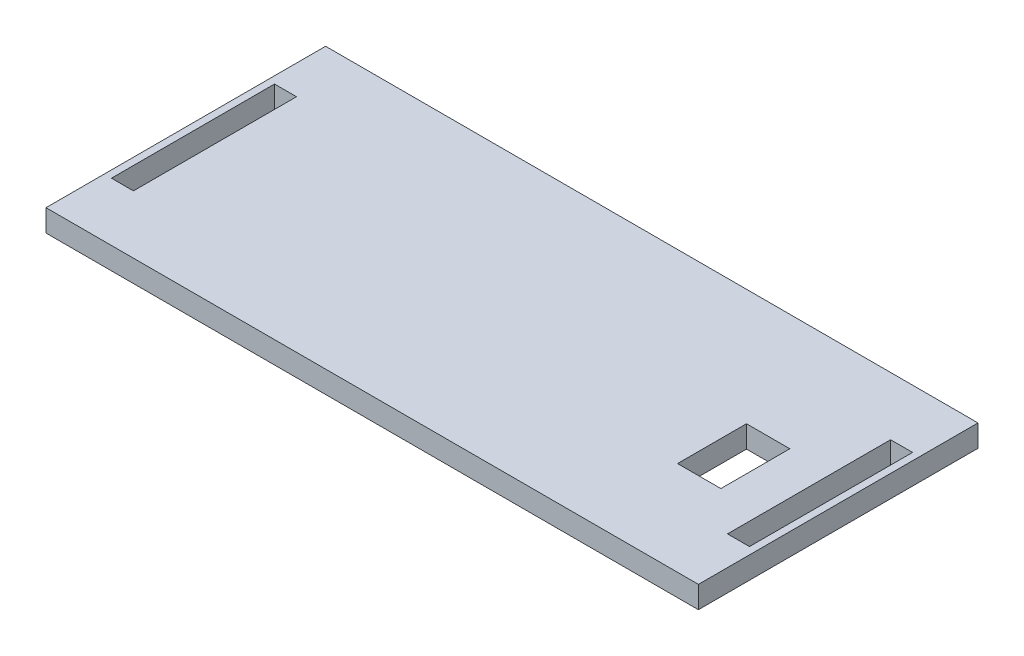
ISO-10303-21;
HEADER;
FILE_DESCRIPTION(('STEP AP214'),'2;1');
FILE_NAME('part.step','',(''),(''),'','','');
FILE_SCHEMA(('AUTOMOTIVE_DESIGN { 1 0 10303 214 1 1 1 1 }'));
ENDSEC;
DATA;
#1=APPLICATION_CONTEXT('core data for automotive mechanical design processes');
#2=APPLICATION_PROTOCOL_DEFINITION('international standard','automotive_design',2000,#1);
#3=PRODUCT_CONTEXT('',#1,'mechanical');
#4=PRODUCT('Part','Part','',(#3));
#5=PRODUCT_RELATED_PRODUCT_CATEGORY('part','',(#4));
#6=PRODUCT_DEFINITION_FORMATION('','',#4);
#7=PRODUCT_DEFINITION_CONTEXT('part definition',#1,'design');
#8=PRODUCT_DEFINITION('design','',#6,#7);
#9=PRODUCT_DEFINITION_SHAPE('','',#8);
#10=(LENGTH_UNIT() NAMED_UNIT(*) SI_UNIT(.MILLI.,.METRE.));
#11=(NAMED_UNIT(*) PLANE_ANGLE_UNIT() SI_UNIT($,.RADIAN.));
#12=(NAMED_UNIT(*) SI_UNIT($,.STERADIAN.) SOLID_ANGLE_UNIT());
#13=UNCERTAINTY_MEASURE_WITH_UNIT(LENGTH_MEASURE(1.E-05),#10,'distance_accuracy_value','');
#14=(GEOMETRIC_REPRESENTATION_CONTEXT(3) GLOBAL_UNCERTAINTY_ASSIGNED_CONTEXT((#13)) GLOBAL_UNIT_ASSIGNED_CONTEXT((#10,
#11,#12)) REPRESENTATION_CONTEXT('',''));
#15=CARTESIAN_POINT('',(0.,0.,0.));
#16=DIRECTION('',(0.,0.,1.));
#17=DIRECTION('',(1.,0.,0.));
#18=AXIS2_PLACEMENT_3D('',#15,#16,#17);
#19=CARTESIAN_POINT('',(0.,5.9944,0.));
#20=DIRECTION('',(0.,1.,0.));
#21=DIRECTION('',(0.,0.,1.));
#22=AXIS2_PLACEMENT_3D('',#19,#20,#21);
#23=PLANE('',#22);
#24=DIRECTION('',(0.,0.,1.));
#25=VECTOR('',#24,1.);
#26=CARTESIAN_POINT('',(0.,5.9944,0.));
#27=LINE('',#26,#25);
#28=CARTESIAN_POINT('',(0.,5.9944,0.));
#29=VERTEX_POINT('',#28);
#30=CARTESIAN_POINT('',(0.,5.9944,76.2));
#31=VERTEX_POINT('',#30);
#32=EDGE_CURVE('E251',#29,#31,#27,.T.);
#33=ORIENTED_EDGE('',*,*,#32,.T.);
#34=DIRECTION('',(1.,0.,0.));
#35=VECTOR('',#34,1.);
#36=CARTESIAN_POINT('',(0.,5.9944,76.2));
#37=LINE('',#36,#35);
#38=CARTESIAN_POINT('',(177.8,5.9944,76.2));
#39=VERTEX_POINT('',#38);
#40=EDGE_CURVE('E254',#31,#39,#37,.T.);
#41=ORIENTED_EDGE('',*,*,#40,.T.);
#42=DIRECTION('',(0.,0.,-1.));
#43=VECTOR('',#42,1.);
#44=CARTESIAN_POINT('',(177.8,5.9944,0.));
#45=LINE('',#44,#43);
#46=CARTESIAN_POINT('',(177.8,5.9944,0.));
#47=VERTEX_POINT('',#46);
#48=EDGE_CURVE('E257',#39,#47,#45,.T.);
#49=ORIENTED_EDGE('',*,*,#48,.T.);
#50=DIRECTION('',(-1.,0.,0.));
#51=VECTOR('',#50,1.);
#52=CARTESIAN_POINT('',(0.,5.9944,0.));
#53=LINE('',#52,#51);
#54=EDGE_CURVE('E259',#47,#29,#53,.T.);
#55=ORIENTED_EDGE('',*,*,#54,.T.);
#56=EDGE_LOOP('',(#33,#41,#49,#55));
#57=FACE_BOUND('',#56,.T.);
#58=DIRECTION('',(1.,0.,0.));
#59=VECTOR('',#58,1.);
#60=CARTESIAN_POINT('',(1.95480000200001,5.9944,60.325));
#61=LINE('',#60,#59);
#62=CARTESIAN_POINT('',(1.95480000200001,5.9944,60.325));
#63=VERTEX_POINT('',#62);
#64=CARTESIAN_POINT('',(7.94920000200001,5.9944,60.325));
#65=VERTEX_POINT('',#64);
#66=EDGE_CURVE('E222',#63,#65,#61,.T.);
#67=ORIENTED_EDGE('',*,*,#66,.F.);
#68=DIRECTION('',(0.,0.,1.));
#69=VECTOR('',#68,1.);
#70=CARTESIAN_POINT('',(1.95480000200001,5.9944,15.875));
#71=LINE('',#70,#69);
#72=CARTESIAN_POINT('',(1.95480000200001,5.9944,15.875));
#73=VERTEX_POINT('',#72);
#74=EDGE_CURVE('E220',#73,#63,#71,.T.);
#75=ORIENTED_EDGE('',*,*,#74,.F.);
#76=DIRECTION('',(-1.,0.,0.));
#77=VECTOR('',#76,1.);
#78=CARTESIAN_POINT('',(1.95480000200001,5.9944,15.875));
#79=LINE('',#78,#77);
#80=CARTESIAN_POINT('',(7.94920000200001,5.9944,15.875));
#81=VERTEX_POINT('',#80);
#82=EDGE_CURVE('E228',#81,#73,#79,.T.);
#83=ORIENTED_EDGE('',*,*,#82,.F.);
#84=DIRECTION('',(0.,0.,-1.));
#85=VECTOR('',#84,1.);
#86=CARTESIAN_POINT('',(7.94920000200001,5.9944,15.875));
#87=LINE('',#86,#85);
#88=EDGE_CURVE('E225',#65,#81,#87,.T.);
#89=ORIENTED_EDGE('',*,*,#88,.F.);
#90=EDGE_LOOP('',(#67,#75,#83,#89));
#91=FACE_BOUND('',#90,.T.);
#92=DIRECTION('',(-1.,0.,0.));
#93=VECTOR('',#92,1.);
#94=CARTESIAN_POINT('',(175.845199998,5.9944,15.875));
#95=LINE('',#94,#93);
#96=CARTESIAN_POINT('',(175.845199998,5.9944,15.875));
#97=VERTEX_POINT('',#96);
#98=CARTESIAN_POINT('',(169.850799998,5.9944,15.875));
#99=VERTEX_POINT('',#98);
#100=EDGE_CURVE('E191',#97,#99,#95,.T.);
#101=ORIENTED_EDGE('',*,*,#100,.F.);
#102=DIRECTION('',(0.,0.,-1.));
#103=VECTOR('',#102,1.);
#104=CARTESIAN_POINT('',(175.845199998,5.9944,15.875));
#105=LINE('',#104,#103);
#106=CARTESIAN_POINT('',(175.845199998,5.9944,60.325));
#107=VERTEX_POINT('',#106);
#108=EDGE_CURVE('E189',#107,#97,#105,.T.);
#109=ORIENTED_EDGE('',*,*,#108,.F.);
#110=DIRECTION('',(1.,0.,0.));
#111=VECTOR('',#110,1.);
#112=CARTESIAN_POINT('',(175.845199998,5.9944,60.325));
#113=LINE('',#112,#111);
#114=CARTESIAN_POINT('',(169.850799998,5.9944,60.325));
#115=VERTEX_POINT('',#114);
#116=EDGE_CURVE('E197',#115,#107,#113,.T.);
#117=ORIENTED_EDGE('',*,*,#116,.F.);
#118=DIRECTION('',(0.,0.,1.));
#119=VECTOR('',#118,1.);
#120=CARTESIAN_POINT('',(169.850799998,5.9944,15.875));
#121=LINE('',#120,#119);
#122=EDGE_CURVE('E194',#99,#115,#121,.T.);
#123=ORIENTED_EDGE('',*,*,#122,.F.);
#124=EDGE_LOOP('',(#101,#109,#117,#123));
#125=FACE_BOUND('',#124,.T.);
#126=DIRECTION('',(-1.,0.,0.));
#127=VECTOR('',#126,1.);
#128=CARTESIAN_POINT('',(158.255699998,5.9944,31.7373));
#129=LINE('',#128,#127);
#130=CARTESIAN_POINT('',(158.255699998,5.9944,31.7373));
#131=VERTEX_POINT('',#130);
#132=CARTESIAN_POINT('',(146.444699998,5.9944,31.7373));
#133=VERTEX_POINT('',#132);
#134=EDGE_CURVE('E161',#131,#133,#129,.T.);
#135=ORIENTED_EDGE('',*,*,#134,.F.);
#136=DIRECTION('',(0.,0.,-1.));
#137=VECTOR('',#136,1.);
#138=CARTESIAN_POINT('',(158.255699998,5.9944,31.7373));
#139=LINE('',#138,#137);
#140=CARTESIAN_POINT('',(158.255699998,5.9944,50.5333));
#141=VERTEX_POINT('',#140);
#142=EDGE_CURVE('E153',#141,#131,#139,.T.);
#143=ORIENTED_EDGE('',*,*,#142,.F.);
#144=DIRECTION('',(1.,0.,0.));
#145=VECTOR('',#144,1.);
#146=CARTESIAN_POINT('',(158.255699998,5.9944,50.5333));
#147=LINE('',#146,#145);
#148=CARTESIAN_POINT('',(146.444699998,5.9944,50.5333));
#149=VERTEX_POINT('',#148);
#150=EDGE_CURVE('E175',#149,#141,#147,.T.);
#151=ORIENTED_EDGE('',*,*,#150,.F.);
#152=DIRECTION('',(0.,0.,1.));
#153=VECTOR('',#152,1.);
#154=CARTESIAN_POINT('',(146.444699998,5.9944,31.7373));
#155=LINE('',#154,#153);
#156=EDGE_CURVE('E173',#133,#149,#155,.T.);
#157=ORIENTED_EDGE('',*,*,#156,.F.);
#158=EDGE_LOOP('',(#135,#143,#151,#157));
#159=FACE_BOUND('',#158,.T.);
#160=ADVANCED_FACE('F40',(#57,#91,#125,#159),#23,.T.);
#161=CARTESIAN_POINT('',(0.,0.,0.));
#162=DIRECTION('',(0.,1.,0.));
#163=DIRECTION('',(0.,0.,1.));
#164=AXIS2_PLACEMENT_3D('',#161,#162,#163);
#165=PLANE('',#164);
#166=DIRECTION('',(0.,0.,-1.));
#167=VECTOR('',#166,1.);
#168=CARTESIAN_POINT('',(175.845199998,0.,15.875));
#169=LINE('',#168,#167);
#170=CARTESIAN_POINT('',(175.845199998,0.,60.325));
#171=VERTEX_POINT('',#170);
#172=CARTESIAN_POINT('',(175.845199998,0.,15.875));
#173=VERTEX_POINT('',#172);
#174=EDGE_CURVE('E169',#171,#173,#169,.T.);
#175=ORIENTED_EDGE('',*,*,#174,.T.);
#176=DIRECTION('',(-1.,0.,0.));
#177=VECTOR('',#176,1.);
#178=CARTESIAN_POINT('',(175.845199998,0.,15.875));
#179=LINE('',#178,#177);
#180=CARTESIAN_POINT('',(169.850799998,0.,15.875));
#181=VERTEX_POINT('',#180);
#182=EDGE_CURVE('E202',#173,#181,#179,.T.);
#183=ORIENTED_EDGE('',*,*,#182,.T.);
#184=DIRECTION('',(0.,0.,1.));
#185=VECTOR('',#184,1.);
#186=CARTESIAN_POINT('',(169.850799998,0.,15.875));
#187=LINE('',#186,#185);
#188=CARTESIAN_POINT('',(169.850799998,0.,60.325));
#189=VERTEX_POINT('',#188);
#190=EDGE_CURVE('E205',#181,#189,#187,.T.);
#191=ORIENTED_EDGE('',*,*,#190,.T.);
#192=DIRECTION('',(1.,0.,0.));
#193=VECTOR('',#192,1.);
#194=CARTESIAN_POINT('',(175.845199998,0.,60.325));
#195=LINE('',#194,#193);
#196=EDGE_CURVE('E192',#189,#171,#195,.T.);
#197=ORIENTED_EDGE('',*,*,#196,.T.);
#198=EDGE_LOOP('',(#175,#183,#191,#197));
#199=FACE_BOUND('',#198,.T.);
#200=DIRECTION('',(0.,0.,1.));
#201=VECTOR('',#200,1.);
#202=CARTESIAN_POINT('',(0.,0.,0.));
#203=LINE('',#202,#201);
#204=CARTESIAN_POINT('',(0.,0.,0.));
#205=VERTEX_POINT('',#204);
#206=CARTESIAN_POINT('',(0.,0.,76.2));
#207=VERTEX_POINT('',#206);
#208=EDGE_CURVE('E250',#205,#207,#203,.T.);
#209=ORIENTED_EDGE('',*,*,#208,.F.);
#210=DIRECTION('',(-1.,0.,0.));
#211=VECTOR('',#210,1.);
#212=CARTESIAN_POINT('',(0.,0.,0.));
#213=LINE('',#212,#211);
#214=CARTESIAN_POINT('',(177.8,0.,0.));
#215=VERTEX_POINT('',#214);
#216=EDGE_CURVE('E255',#215,#205,#213,.T.);
#217=ORIENTED_EDGE('',*,*,#216,.F.);
#218=DIRECTION('',(0.,0.,-1.));
#219=VECTOR('',#218,1.);
#220=CARTESIAN_POINT('',(177.8,0.,0.));
#221=LINE('',#220,#219);
#222=CARTESIAN_POINT('',(177.8,0.,76.2));
#223=VERTEX_POINT('',#222);
#224=EDGE_CURVE('E266',#223,#215,#221,.T.);
#225=ORIENTED_EDGE('',*,*,#224,.F.);
#226=DIRECTION('',(1.,0.,0.));
#227=VECTOR('',#226,1.);
#228=CARTESIAN_POINT('',(0.,0.,76.2));
#229=LINE('',#228,#227);
#230=EDGE_CURVE('E264',#207,#223,#229,.T.);
#231=ORIENTED_EDGE('',*,*,#230,.F.);
#232=EDGE_LOOP('',(#209,#217,#225,#231));
#233=FACE_BOUND('',#232,.T.);
#234=DIRECTION('',(0.,0.,1.));
#235=VECTOR('',#234,1.);
#236=CARTESIAN_POINT('',(1.95480000200001,0.,15.875));
#237=LINE('',#236,#235);
#238=CARTESIAN_POINT('',(1.95480000200001,0.,15.875));
#239=VERTEX_POINT('',#238);
#240=CARTESIAN_POINT('',(1.95480000200001,0.,60.325));
#241=VERTEX_POINT('',#240);
#242=EDGE_CURVE('E219',#239,#241,#237,.T.);
#243=ORIENTED_EDGE('',*,*,#242,.T.);
#244=DIRECTION('',(1.,0.,0.));
#245=VECTOR('',#244,1.);
#246=CARTESIAN_POINT('',(1.95480000200001,0.,60.325));
#247=LINE('',#246,#245);
#248=CARTESIAN_POINT('',(7.94920000200001,0.,60.325));
#249=VERTEX_POINT('',#248);
#250=EDGE_CURVE('E233',#241,#249,#247,.T.);
#251=ORIENTED_EDGE('',*,*,#250,.T.);
#252=DIRECTION('',(0.,0.,-1.));
#253=VECTOR('',#252,1.);
#254=CARTESIAN_POINT('',(7.94920000200001,0.,15.875));
#255=LINE('',#254,#253);
#256=CARTESIAN_POINT('',(7.94920000200001,0.,15.875));
#257=VERTEX_POINT('',#256);
#258=EDGE_CURVE('E236',#249,#257,#255,.T.);
#259=ORIENTED_EDGE('',*,*,#258,.T.);
#260=DIRECTION('',(-1.,0.,0.));
#261=VECTOR('',#260,1.);
#262=CARTESIAN_POINT('',(1.95480000200001,0.,15.875));
#263=LINE('',#262,#261);
#264=EDGE_CURVE('E223',#257,#239,#263,.T.);
#265=ORIENTED_EDGE('',*,*,#264,.T.);
#266=EDGE_LOOP('',(#243,#251,#259,#265));
#267=FACE_BOUND('',#266,.T.);
#268=DIRECTION('',(0.,0.,-1.));
#269=VECTOR('',#268,1.);
#270=CARTESIAN_POINT('',(158.255699998,0.,31.7373));
#271=LINE('',#270,#269);
#272=CARTESIAN_POINT('',(158.255699998,0.,50.5333));
#273=VERTEX_POINT('',#272);
#274=CARTESIAN_POINT('',(158.255699998,0.,31.7373));
#275=VERTEX_POINT('',#274);
#276=EDGE_CURVE('E63',#273,#275,#271,.T.);
#277=ORIENTED_EDGE('',*,*,#276,.T.);
#278=DIRECTION('',(-1.,0.,0.));
#279=VECTOR('',#278,1.);
#280=CARTESIAN_POINT('',(158.255699998,0.,31.7373));
#281=LINE('',#280,#279);
#282=CARTESIAN_POINT('',(146.444699998,0.,31.7373));
#283=VERTEX_POINT('',#282);
#284=EDGE_CURVE('E168',#275,#283,#281,.T.);
#285=ORIENTED_EDGE('',*,*,#284,.T.);
#286=DIRECTION('',(0.,0.,1.));
#287=VECTOR('',#286,1.);
#288=CARTESIAN_POINT('',(146.444699998,0.,31.7373));
#289=LINE('',#288,#287);
#290=CARTESIAN_POINT('',(146.444699998,0.,50.5333));
#291=VERTEX_POINT('',#290);
#292=EDGE_CURVE('E181',#283,#291,#289,.T.);
#293=ORIENTED_EDGE('',*,*,#292,.T.);
#294=DIRECTION('',(1.,0.,0.));
#295=VECTOR('',#294,1.);
#296=CARTESIAN_POINT('',(158.255699998,0.,50.5333));
#297=LINE('',#296,#295);
#298=EDGE_CURVE('E162',#291,#273,#297,.T.);
#299=ORIENTED_EDGE('',*,*,#298,.T.);
#300=EDGE_LOOP('',(#277,#285,#293,#299));
#301=FACE_BOUND('',#300,.T.);
#302=ADVANCED_FACE('F284',(#199,#233,#267,#301),#165,.F.);
#303=CARTESIAN_POINT('',(0.,5.9944,0.));
#304=DIRECTION('',(1.,0.,0.));
#305=DIRECTION('',(0.,0.,-1.));
#306=AXIS2_PLACEMENT_3D('',#303,#304,#305);
#307=PLANE('',#306);
#308=ORIENTED_EDGE('',*,*,#208,.T.);
#309=DIRECTION('',(0.,-1.,0.));
#310=VECTOR('',#309,1.);
#311=CARTESIAN_POINT('',(0.,5.9944,76.2));
#312=LINE('',#311,#310);
#313=EDGE_CURVE('E11',#31,#207,#312,.T.);
#314=ORIENTED_EDGE('',*,*,#313,.F.);
#315=ORIENTED_EDGE('',*,*,#32,.F.);
#316=DIRECTION('',(0.,-1.,0.));
#317=VECTOR('',#316,1.);
#318=CARTESIAN_POINT('',(0.,5.9944,0.));
#319=LINE('',#318,#317);
#320=EDGE_CURVE('E261',#29,#205,#319,.T.);
#321=ORIENTED_EDGE('',*,*,#320,.T.);
#322=EDGE_LOOP('',(#308,#314,#315,#321));
#323=FACE_BOUND('',#322,.T.);
#324=ADVANCED_FACE('F42',(#323),#307,.F.);
#325=CARTESIAN_POINT('',(0.,5.9944,76.2));
#326=DIRECTION('',(0.,0.,-1.));
#327=DIRECTION('',(-1.,0.,0.));
#328=AXIS2_PLACEMENT_3D('',#325,#326,#327);
#329=PLANE('',#328);
#330=ORIENTED_EDGE('',*,*,#230,.T.);
#331=DIRECTION('',(0.,-1.,0.));
#332=VECTOR('',#331,1.);
#333=CARTESIAN_POINT('',(177.8,5.9944,76.2));
#334=LINE('',#333,#332);
#335=EDGE_CURVE('E48',#39,#223,#334,.T.);
#336=ORIENTED_EDGE('',*,*,#335,.F.);
#337=ORIENTED_EDGE('',*,*,#40,.F.);
#338=ORIENTED_EDGE('',*,*,#313,.T.);
#339=EDGE_LOOP('',(#330,#336,#337,#338));
#340=FACE_BOUND('',#339,.T.);
#341=ADVANCED_FACE('F295',(#340),#329,.F.);
#342=CARTESIAN_POINT('',(177.8,5.9944,0.));
#343=DIRECTION('',(-1.,0.,0.));
#344=DIRECTION('',(0.,0.,1.));
#345=AXIS2_PLACEMENT_3D('',#342,#343,#344);
#346=PLANE('',#345);
#347=ORIENTED_EDGE('',*,*,#224,.T.);
#348=DIRECTION('',(0.,-1.,0.));
#349=VECTOR('',#348,1.);
#350=CARTESIAN_POINT('',(177.8,5.9944,0.));
#351=LINE('',#350,#349);
#352=EDGE_CURVE('E271',#47,#215,#351,.T.);
#353=ORIENTED_EDGE('',*,*,#352,.F.);
#354=ORIENTED_EDGE('',*,*,#48,.F.);
#355=ORIENTED_EDGE('',*,*,#335,.T.);
#356=EDGE_LOOP('',(#347,#353,#354,#355));
#357=FACE_BOUND('',#356,.T.);
#358=ADVANCED_FACE('F278',(#357),#346,.F.);
#359=CARTESIAN_POINT('',(0.,5.9944,0.));
#360=DIRECTION('',(0.,0.,1.));
#361=DIRECTION('',(1.,0.,0.));
#362=AXIS2_PLACEMENT_3D('',#359,#360,#361);
#363=PLANE('',#362);
#364=ORIENTED_EDGE('',*,*,#216,.T.);
#365=ORIENTED_EDGE('',*,*,#320,.F.);
#366=ORIENTED_EDGE('',*,*,#54,.F.);
#367=ORIENTED_EDGE('',*,*,#352,.T.);
#368=EDGE_LOOP('',(#364,#365,#366,#367));
#369=FACE_BOUND('',#368,.T.);
#370=ADVANCED_FACE('F288',(#369),#363,.F.);
#371=CARTESIAN_POINT('',(1.95480000200001,5.9944,15.875));
#372=DIRECTION('',(1.,0.,0.));
#373=DIRECTION('',(0.,0.,-1.));
#374=AXIS2_PLACEMENT_3D('',#371,#372,#373);
#375=PLANE('',#374);
#376=ORIENTED_EDGE('',*,*,#242,.F.);
#377=DIRECTION('',(0.,-1.,0.));
#378=VECTOR('',#377,1.);
#379=CARTESIAN_POINT('',(1.95480000200001,5.9944,15.875));
#380=LINE('',#379,#378);
#381=EDGE_CURVE('E230',#73,#239,#380,.T.);
#382=ORIENTED_EDGE('',*,*,#381,.F.);
#383=ORIENTED_EDGE('',*,*,#74,.T.);
#384=DIRECTION('',(0.,-1.,0.));
#385=VECTOR('',#384,1.);
#386=CARTESIAN_POINT('',(1.95480000200001,5.9944,60.325));
#387=LINE('',#386,#385);
#388=EDGE_CURVE('E247',#63,#241,#387,.T.);
#389=ORIENTED_EDGE('',*,*,#388,.T.);
#390=EDGE_LOOP('',(#376,#382,#383,#389));
#391=FACE_BOUND('',#390,.T.);
#392=ADVANCED_FACE('F310',(#391),#375,.T.);
#393=CARTESIAN_POINT('',(1.95480000200001,5.9944,60.325));
#394=DIRECTION('',(0.,0.,-1.));
#395=DIRECTION('',(-1.,0.,0.));
#396=AXIS2_PLACEMENT_3D('',#393,#394,#395);
#397=PLANE('',#396);
#398=ORIENTED_EDGE('',*,*,#250,.F.);
#399=ORIENTED_EDGE('',*,*,#388,.F.);
#400=ORIENTED_EDGE('',*,*,#66,.T.);
#401=DIRECTION('',(0.,-1.,0.));
#402=VECTOR('',#401,1.);
#403=CARTESIAN_POINT('',(7.94920000200001,5.9944,60.325));
#404=LINE('',#403,#402);
#405=EDGE_CURVE('E245',#65,#249,#404,.T.);
#406=ORIENTED_EDGE('',*,*,#405,.T.);
#407=EDGE_LOOP('',(#398,#399,#400,#406));
#408=FACE_BOUND('',#407,.T.);
#409=ADVANCED_FACE('F317',(#408),#397,.T.);
#410=CARTESIAN_POINT('',(7.94920000200001,5.9944,15.875));
#411=DIRECTION('',(-1.,0.,0.));
#412=DIRECTION('',(0.,0.,1.));
#413=AXIS2_PLACEMENT_3D('',#410,#411,#412);
#414=PLANE('',#413);
#415=ORIENTED_EDGE('',*,*,#258,.F.);
#416=ORIENTED_EDGE('',*,*,#405,.F.);
#417=ORIENTED_EDGE('',*,*,#88,.T.);
#418=DIRECTION('',(0.,-1.,0.));
#419=VECTOR('',#418,1.);
#420=CARTESIAN_POINT('',(7.94920000200001,5.9944,15.875));
#421=LINE('',#420,#419);
#422=EDGE_CURVE('E243',#81,#257,#421,.T.);
#423=ORIENTED_EDGE('',*,*,#422,.T.);
#424=EDGE_LOOP('',(#415,#416,#417,#423));
#425=FACE_BOUND('',#424,.T.);
#426=ADVANCED_FACE('F322',(#425),#414,.T.);
#427=CARTESIAN_POINT('',(1.95480000200001,5.9944,15.875));
#428=DIRECTION('',(0.,0.,1.));
#429=DIRECTION('',(1.,0.,0.));
#430=AXIS2_PLACEMENT_3D('',#427,#428,#429);
#431=PLANE('',#430);
#432=ORIENTED_EDGE('',*,*,#264,.F.);
#433=ORIENTED_EDGE('',*,*,#422,.F.);
#434=ORIENTED_EDGE('',*,*,#82,.T.);
#435=ORIENTED_EDGE('',*,*,#381,.T.);
#436=EDGE_LOOP('',(#432,#433,#434,#435));
#437=FACE_BOUND('',#436,.T.);
#438=ADVANCED_FACE('F329',(#437),#431,.T.);
#439=CARTESIAN_POINT('',(175.845199998,5.9944,15.875));
#440=DIRECTION('',(-1.,0.,0.));
#441=DIRECTION('',(0.,0.,1.));
#442=AXIS2_PLACEMENT_3D('',#439,#440,#441);
#443=PLANE('',#442);
#444=ORIENTED_EDGE('',*,*,#174,.F.);
#445=DIRECTION('',(0.,-1.,0.));
#446=VECTOR('',#445,1.);
#447=CARTESIAN_POINT('',(175.845199998,5.9944,60.325));
#448=LINE('',#447,#446);
#449=EDGE_CURVE('E199',#107,#171,#448,.T.);
#450=ORIENTED_EDGE('',*,*,#449,.F.);
#451=ORIENTED_EDGE('',*,*,#108,.T.);
#452=DIRECTION('',(0.,-1.,0.));
#453=VECTOR('',#452,1.);
#454=CARTESIAN_POINT('',(175.845199998,5.9944,15.875));
#455=LINE('',#454,#453);
#456=EDGE_CURVE('E216',#97,#173,#455,.T.);
#457=ORIENTED_EDGE('',*,*,#456,.T.);
#458=EDGE_LOOP('',(#444,#450,#451,#457));
#459=FACE_BOUND('',#458,.T.);
#460=ADVANCED_FACE('F351',(#459),#443,.T.);
#461=CARTESIAN_POINT('',(175.845199998,5.9944,15.875));
#462=DIRECTION('',(0.,0.,1.));
#463=DIRECTION('',(1.,0.,0.));
#464=AXIS2_PLACEMENT_3D('',#461,#462,#463);
#465=PLANE('',#464);
#466=ORIENTED_EDGE('',*,*,#182,.F.);
#467=ORIENTED_EDGE('',*,*,#456,.F.);
#468=ORIENTED_EDGE('',*,*,#100,.T.);
#469=DIRECTION('',(0.,-1.,0.));
#470=VECTOR('',#469,1.);
#471=CARTESIAN_POINT('',(169.850799998,5.9944,15.875));
#472=LINE('',#471,#470);
#473=EDGE_CURVE('E214',#99,#181,#472,.T.);
#474=ORIENTED_EDGE('',*,*,#473,.T.);
#475=EDGE_LOOP('',(#466,#467,#468,#474));
#476=FACE_BOUND('',#475,.T.);
#477=ADVANCED_FACE('F345',(#476),#465,.T.);
#478=CARTESIAN_POINT('',(169.850799998,5.9944,15.875));
#479=DIRECTION('',(1.,0.,0.));
#480=DIRECTION('',(0.,0.,-1.));
#481=AXIS2_PLACEMENT_3D('',#478,#479,#480);
#482=PLANE('',#481);
#483=ORIENTED_EDGE('',*,*,#190,.F.);
#484=ORIENTED_EDGE('',*,*,#473,.F.);
#485=ORIENTED_EDGE('',*,*,#122,.T.);
#486=DIRECTION('',(0.,-1.,0.));
#487=VECTOR('',#486,1.);
#488=CARTESIAN_POINT('',(169.850799998,5.9944,60.325));
#489=LINE('',#488,#487);
#490=EDGE_CURVE('E212',#115,#189,#489,.T.);
#491=ORIENTED_EDGE('',*,*,#490,.T.);
#492=EDGE_LOOP('',(#483,#484,#485,#491));
#493=FACE_BOUND('',#492,.T.);
#494=ADVANCED_FACE('F348',(#493),#482,.T.);
#495=CARTESIAN_POINT('',(175.845199998,5.9944,60.325));
#496=DIRECTION('',(0.,0.,-1.));
#497=DIRECTION('',(-1.,0.,0.));
#498=AXIS2_PLACEMENT_3D('',#495,#496,#497);
#499=PLANE('',#498);
#500=ORIENTED_EDGE('',*,*,#196,.F.);
#501=ORIENTED_EDGE('',*,*,#490,.F.);
#502=ORIENTED_EDGE('',*,*,#116,.T.);
#503=ORIENTED_EDGE('',*,*,#449,.T.);
#504=EDGE_LOOP('',(#500,#501,#502,#503));
#505=FACE_BOUND('',#504,.T.);
#506=ADVANCED_FACE('F354',(#505),#499,.T.);
#507=CARTESIAN_POINT('',(158.255699998,5.9944,31.7373));
#508=DIRECTION('',(-1.,0.,0.));
#509=DIRECTION('',(0.,0.,1.));
#510=AXIS2_PLACEMENT_3D('',#507,#508,#509);
#511=PLANE('',#510);
#512=ORIENTED_EDGE('',*,*,#276,.F.);
#513=DIRECTION('',(0.,-1.,0.));
#514=VECTOR('',#513,1.);
#515=CARTESIAN_POINT('',(158.255699998,5.9944,50.5333));
#516=LINE('',#515,#514);
#517=EDGE_CURVE('E157',#141,#273,#516,.T.);
#518=ORIENTED_EDGE('',*,*,#517,.F.);
#519=ORIENTED_EDGE('',*,*,#142,.T.);
#520=DIRECTION('',(0.,-1.,0.));
#521=VECTOR('',#520,1.);
#522=CARTESIAN_POINT('',(158.255699998,5.9944,31.7373));
#523=LINE('',#522,#521);
#524=EDGE_CURVE('E156',#131,#275,#523,.T.);
#525=ORIENTED_EDGE('',*,*,#524,.T.);
#526=EDGE_LOOP('',(#512,#518,#519,#525));
#527=FACE_BOUND('',#526,.T.);
#528=ADVANCED_FACE('F155',(#527),#511,.T.);
#529=CARTESIAN_POINT('',(158.255699998,5.9944,31.7373));
#530=DIRECTION('',(0.,0.,1.));
#531=DIRECTION('',(1.,0.,0.));
#532=AXIS2_PLACEMENT_3D('',#529,#530,#531);
#533=PLANE('',#532);
#534=ORIENTED_EDGE('',*,*,#284,.F.);
#535=ORIENTED_EDGE('',*,*,#524,.F.);
#536=ORIENTED_EDGE('',*,*,#134,.T.);
#537=DIRECTION('',(0.,-1.,0.));
#538=VECTOR('',#537,1.);
#539=CARTESIAN_POINT('',(146.444699998,5.9944,31.7373));
#540=LINE('',#539,#538);
#541=EDGE_CURVE('E170',#133,#283,#540,.T.);
#542=ORIENTED_EDGE('',*,*,#541,.T.);
#543=EDGE_LOOP('',(#534,#535,#536,#542));
#544=FACE_BOUND('',#543,.T.);
#545=ADVANCED_FACE('F165',(#544),#533,.T.);
#546=CARTESIAN_POINT('',(146.444699998,5.9944,31.7373));
#547=DIRECTION('',(1.,0.,0.));
#548=DIRECTION('',(0.,0.,-1.));
#549=AXIS2_PLACEMENT_3D('',#546,#547,#548);
#550=PLANE('',#549);
#551=ORIENTED_EDGE('',*,*,#292,.F.);
#552=ORIENTED_EDGE('',*,*,#541,.F.);
#553=ORIENTED_EDGE('',*,*,#156,.T.);
#554=DIRECTION('',(0.,-1.,0.));
#555=VECTOR('',#554,1.);
#556=CARTESIAN_POINT('',(146.444699998,5.9944,50.5333));
#557=LINE('',#556,#555);
#558=EDGE_CURVE('E55',#149,#291,#557,.T.);
#559=ORIENTED_EDGE('',*,*,#558,.T.);
#560=EDGE_LOOP('',(#551,#552,#553,#559));
#561=FACE_BOUND('',#560,.T.);
#562=ADVANCED_FACE('F414',(#561),#550,.T.);
#563=CARTESIAN_POINT('',(158.255699998,5.9944,50.5333));
#564=DIRECTION('',(0.,0.,-1.));
#565=DIRECTION('',(-1.,0.,0.));
#566=AXIS2_PLACEMENT_3D('',#563,#564,#565);
#567=PLANE('',#566);
#568=ORIENTED_EDGE('',*,*,#298,.F.);
#569=ORIENTED_EDGE('',*,*,#558,.F.);
#570=ORIENTED_EDGE('',*,*,#150,.T.);
#571=ORIENTED_EDGE('',*,*,#517,.T.);
#572=EDGE_LOOP('',(#568,#569,#570,#571));
#573=FACE_BOUND('',#572,.T.);
#574=ADVANCED_FACE('F423',(#573),#567,.T.);
#575=CLOSED_SHELL('',(#160,#302,#324,#341,#358,#370,#392,#409,#426,#438,#460,#477,#494,#506,
#528,#545,#562,#574));
#576=MANIFOLD_SOLID_BREP('B2',#575);
#577=ADVANCED_BREP_SHAPE_REPRESENTATION('',(#18,#576),#14);
#578=SHAPE_DEFINITION_REPRESENTATION(#9,#577);
ENDSEC;
END-ISO-10303-21;
